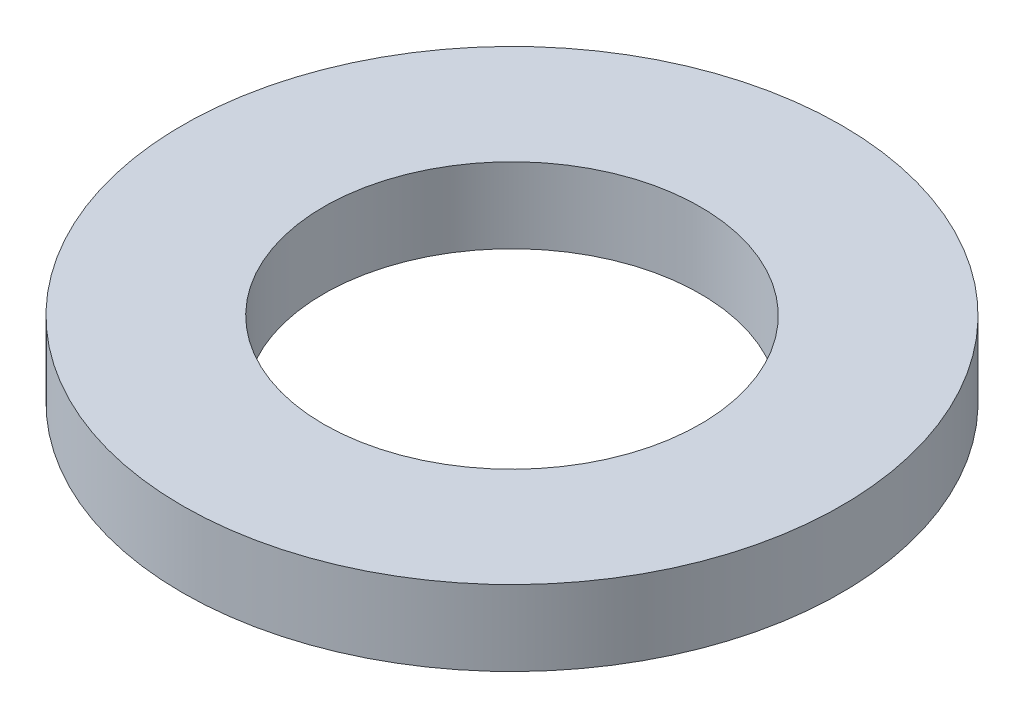
ISO-10303-21;
HEADER;
FILE_DESCRIPTION(('STEP AP214'),'2;1');
FILE_NAME('part.step','',(''),(''),'','','');
FILE_SCHEMA(('AUTOMOTIVE_DESIGN { 1 0 10303 214 1 1 1 1 }'));
ENDSEC;
DATA;
#1=APPLICATION_CONTEXT('core data for automotive mechanical design processes');
#2=APPLICATION_PROTOCOL_DEFINITION('international standard','automotive_design',2000,#1);
#3=PRODUCT_CONTEXT('',#1,'mechanical');
#4=PRODUCT('Part','Part','',(#3));
#5=PRODUCT_RELATED_PRODUCT_CATEGORY('part','',(#4));
#6=PRODUCT_DEFINITION_FORMATION('','',#4);
#7=PRODUCT_DEFINITION_CONTEXT('part definition',#1,'design');
#8=PRODUCT_DEFINITION('design','',#6,#7);
#9=PRODUCT_DEFINITION_SHAPE('','',#8);
#10=(LENGTH_UNIT() NAMED_UNIT(*) SI_UNIT(.MILLI.,.METRE.));
#11=(NAMED_UNIT(*) PLANE_ANGLE_UNIT() SI_UNIT($,.RADIAN.));
#12=(NAMED_UNIT(*) SI_UNIT($,.STERADIAN.) SOLID_ANGLE_UNIT());
#13=UNCERTAINTY_MEASURE_WITH_UNIT(LENGTH_MEASURE(1.E-05),#10,'distance_accuracy_value','');
#14=(GEOMETRIC_REPRESENTATION_CONTEXT(3) GLOBAL_UNCERTAINTY_ASSIGNED_CONTEXT((#13)) GLOBAL_UNIT_ASSIGNED_CONTEXT((#10,
#11,#12)) REPRESENTATION_CONTEXT('',''));
#15=CARTESIAN_POINT('',(0.,0.,0.));
#16=DIRECTION('',(0.,0.,1.));
#17=DIRECTION('',(1.,0.,0.));
#18=AXIS2_PLACEMENT_3D('',#15,#16,#17);
#19=CARTESIAN_POINT('',(0.,1.6,0.));
#20=DIRECTION('',(0.,1.,0.));
#21=DIRECTION('',(0.,0.,1.));
#22=AXIS2_PLACEMENT_3D('',#19,#20,#21);
#23=PLANE('',#22);
#24=CARTESIAN_POINT('',(0.,1.6,0.));
#25=DIRECTION('',(0.,1.,0.));
#26=DIRECTION('',(0.,0.,1.));
#27=AXIS2_PLACEMENT_3D('',#24,#25,#26);
#28=CIRCLE('',#27,7.);
#29=CARTESIAN_POINT('',(0.,1.6,7.));
#30=VERTEX_POINT('',#29);
#31=EDGE_CURVE('E10',#30,#30,#28,.T.);
#32=ORIENTED_EDGE('',*,*,#31,.T.);
#33=EDGE_LOOP('',(#32));
#34=FACE_BOUND('',#33,.T.);
#35=CARTESIAN_POINT('',(0.,1.6,0.));
#36=DIRECTION('',(0.,1.,0.));
#37=DIRECTION('',(0.,0.,1.));
#38=AXIS2_PLACEMENT_3D('',#35,#36,#37);
#39=CIRCLE('',#38,4.);
#40=CARTESIAN_POINT('',(0.,1.6,4.));
#41=VERTEX_POINT('',#40);
#42=EDGE_CURVE('E42',#41,#41,#39,.T.);
#43=ORIENTED_EDGE('',*,*,#42,.F.);
#44=EDGE_LOOP('',(#43));
#45=FACE_BOUND('',#44,.T.);
#46=ADVANCED_FACE('F31',(#34,#45),#23,.T.);
#47=CARTESIAN_POINT('',(0.,0.,0.));
#48=DIRECTION('',(0.,1.,0.));
#49=DIRECTION('',(0.,0.,1.));
#50=AXIS2_PLACEMENT_3D('',#47,#48,#49);
#51=PLANE('',#50);
#52=CARTESIAN_POINT('',(0.,0.,0.));
#53=DIRECTION('',(0.,1.,0.));
#54=DIRECTION('',(0.,0.,1.));
#55=AXIS2_PLACEMENT_3D('',#52,#53,#54);
#56=CIRCLE('',#55,7.);
#57=CARTESIAN_POINT('',(0.,0.,7.));
#58=VERTEX_POINT('',#57);
#59=EDGE_CURVE('E35',#58,#58,#56,.T.);
#60=ORIENTED_EDGE('',*,*,#59,.F.);
#61=EDGE_LOOP('',(#60));
#62=FACE_BOUND('',#61,.T.);
#63=CARTESIAN_POINT('',(0.,0.,0.));
#64=DIRECTION('',(0.,1.,0.));
#65=DIRECTION('',(0.,0.,1.));
#66=AXIS2_PLACEMENT_3D('',#63,#64,#65);
#67=CIRCLE('',#66,4.);
#68=CARTESIAN_POINT('',(0.,0.,4.));
#69=VERTEX_POINT('',#68);
#70=EDGE_CURVE('E44',#69,#69,#67,.T.);
#71=ORIENTED_EDGE('',*,*,#70,.T.);
#72=EDGE_LOOP('',(#71));
#73=FACE_BOUND('',#72,.T.);
#74=ADVANCED_FACE('F54',(#62,#73),#51,.F.);
#75=CARTESIAN_POINT('',(0.,1.6,0.));
#76=DIRECTION('',(0.,-1.,0.));
#77=DIRECTION('',(0.,0.,-1.));
#78=AXIS2_PLACEMENT_3D('',#75,#76,#77);
#79=CYLINDRICAL_SURFACE('',#78,7.);
#80=ORIENTED_EDGE('',*,*,#31,.F.);
#81=EDGE_LOOP('',(#80));
#82=FACE_BOUND('',#81,.T.);
#83=ORIENTED_EDGE('',*,*,#59,.T.);
#84=EDGE_LOOP('',(#83));
#85=FACE_BOUND('',#84,.T.);
#86=ADVANCED_FACE('F33',(#82,#85),#79,.T.);
#87=CARTESIAN_POINT('',(0.,1.6,0.));
#88=DIRECTION('',(0.,-1.,0.));
#89=DIRECTION('',(0.,0.,-1.));
#90=AXIS2_PLACEMENT_3D('',#87,#88,#89);
#91=CYLINDRICAL_SURFACE('',#90,4.);
#92=ORIENTED_EDGE('',*,*,#42,.T.);
#93=EDGE_LOOP('',(#92));
#94=FACE_BOUND('',#93,.T.);
#95=ORIENTED_EDGE('',*,*,#70,.F.);
#96=EDGE_LOOP('',(#95));
#97=FACE_BOUND('',#96,.T.);
#98=ADVANCED_FACE('F50',(#94,#97),#91,.F.);
#99=CLOSED_SHELL('',(#46,#74,#86,#98));
#100=MANIFOLD_SOLID_BREP('B2',#99);
#101=ADVANCED_BREP_SHAPE_REPRESENTATION('',(#18,#100),#14);
#102=SHAPE_DEFINITION_REPRESENTATION(#9,#101);
ENDSEC;
END-ISO-10303-21;
